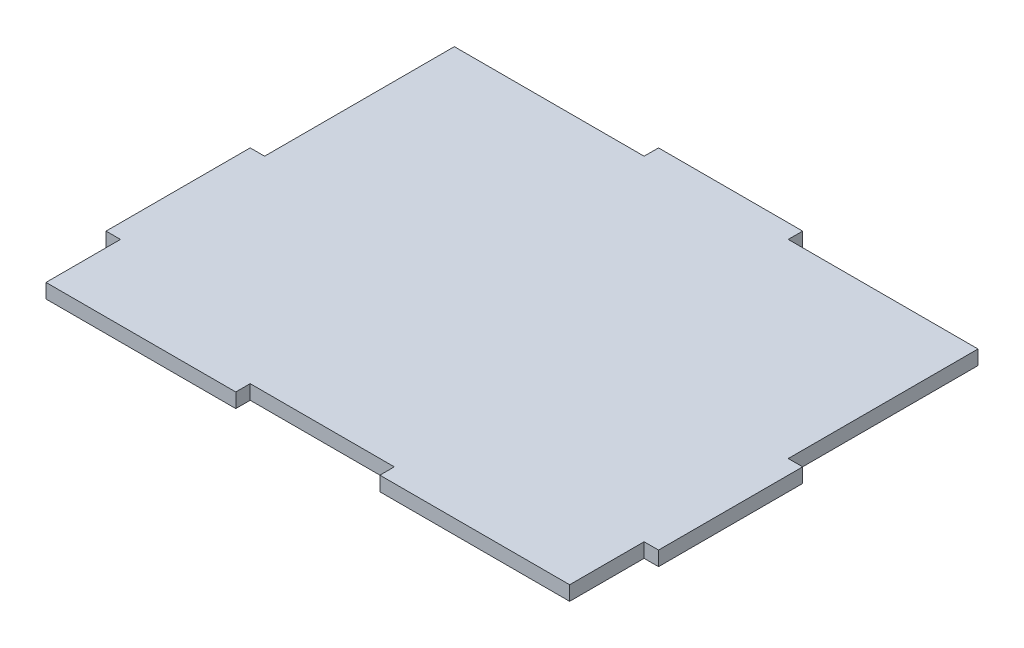
ISO-10303-21;
HEADER;
FILE_DESCRIPTION(('STEP AP214'),'2;1');
FILE_NAME('part.step','',(''),(''),'','','');
FILE_SCHEMA(('AUTOMOTIVE_DESIGN { 1 0 10303 214 1 1 1 1 }'));
ENDSEC;
DATA;
#1=APPLICATION_CONTEXT('core data for automotive mechanical design processes');
#2=APPLICATION_PROTOCOL_DEFINITION('international standard','automotive_design',2000,#1);
#3=PRODUCT_CONTEXT('',#1,'mechanical');
#4=PRODUCT('Part','Part','',(#3));
#5=PRODUCT_RELATED_PRODUCT_CATEGORY('part','',(#4));
#6=PRODUCT_DEFINITION_FORMATION('','',#4);
#7=PRODUCT_DEFINITION_CONTEXT('part definition',#1,'design');
#8=PRODUCT_DEFINITION('design','',#6,#7);
#9=PRODUCT_DEFINITION_SHAPE('','',#8);
#10=(LENGTH_UNIT() NAMED_UNIT(*) SI_UNIT(.MILLI.,.METRE.));
#11=(NAMED_UNIT(*) PLANE_ANGLE_UNIT() SI_UNIT($,.RADIAN.));
#12=(NAMED_UNIT(*) SI_UNIT($,.STERADIAN.) SOLID_ANGLE_UNIT());
#13=UNCERTAINTY_MEASURE_WITH_UNIT(LENGTH_MEASURE(1.E-05),#10,'distance_accuracy_value','');
#14=(GEOMETRIC_REPRESENTATION_CONTEXT(3) GLOBAL_UNCERTAINTY_ASSIGNED_CONTEXT((#13)) GLOBAL_UNIT_ASSIGNED_CONTEXT((#10,
#11,#12)) REPRESENTATION_CONTEXT('',''));
#15=CARTESIAN_POINT('',(0.,0.,0.));
#16=DIRECTION('',(0.,0.,1.));
#17=DIRECTION('',(1.,0.,0.));
#18=AXIS2_PLACEMENT_3D('',#15,#16,#17);
#19=CARTESIAN_POINT('',(54.5,3.,0.));
#20=DIRECTION('',(1.,0.,0.));
#21=DIRECTION('',(0.,0.,-1.));
#22=AXIS2_PLACEMENT_3D('',#19,#20,#21);
#23=PLANE('',#22);
#24=DIRECTION('',(0.,1.,0.));
#25=VECTOR('',#24,1.);
#26=CARTESIAN_POINT('',(54.5,-7.,30.4997169116293));
#27=LINE('',#26,#25);
#28=CARTESIAN_POINT('',(54.5,0.,30.4997169116293));
#29=VERTEX_POINT('',#28);
#30=CARTESIAN_POINT('',(54.5,3.,30.4997169116293));
#31=VERTEX_POINT('',#30);
#32=EDGE_CURVE('E290',#29,#31,#27,.T.);
#33=ORIENTED_EDGE('',*,*,#32,.F.);
#34=DIRECTION('',(0.,0.,1.));
#35=VECTOR('',#34,1.);
#36=CARTESIAN_POINT('',(54.5,0.,0.));
#37=LINE('',#36,#35);
#38=CARTESIAN_POINT('',(54.5,0.,15.));
#39=VERTEX_POINT('',#38);
#40=EDGE_CURVE('E192',#39,#29,#37,.T.);
#41=ORIENTED_EDGE('',*,*,#40,.F.);
#42=DIRECTION('',(0.,-1.,0.));
#43=VECTOR('',#42,1.);
#44=CARTESIAN_POINT('',(54.5,3.,15.));
#45=LINE('',#44,#43);
#46=CARTESIAN_POINT('',(54.5,3.,15.));
#47=VERTEX_POINT('',#46);
#48=EDGE_CURVE('E122',#47,#39,#45,.T.);
#49=ORIENTED_EDGE('',*,*,#48,.F.);
#50=DIRECTION('',(0.,0.,1.));
#51=VECTOR('',#50,1.);
#52=CARTESIAN_POINT('',(54.5,3.,0.));
#53=LINE('',#52,#51);
#54=EDGE_CURVE('E296',#47,#31,#53,.T.);
#55=ORIENTED_EDGE('',*,*,#54,.T.);
#56=EDGE_LOOP('',(#33,#41,#49,#55));
#57=FACE_BOUND('',#56,.T.);
#58=ADVANCED_FACE('F39',(#57),#23,.T.);
#59=CARTESIAN_POINT('',(0.,3.,15.));
#60=DIRECTION('',(0.,0.,-1.));
#61=DIRECTION('',(-1.,0.,0.));
#62=AXIS2_PLACEMENT_3D('',#59,#60,#61);
#63=PLANE('',#62);
#64=DIRECTION('',(1.,0.,0.));
#65=VECTOR('',#64,1.);
#66=CARTESIAN_POINT('',(0.,0.,15.));
#67=LINE('',#66,#65);
#68=CARTESIAN_POINT('',(57.5,0.,15.));
#69=VERTEX_POINT('',#68);
#70=EDGE_CURVE('E195',#39,#69,#67,.T.);
#71=ORIENTED_EDGE('',*,*,#70,.T.);
#72=DIRECTION('',(0.,-1.,0.));
#73=VECTOR('',#72,1.);
#74=CARTESIAN_POINT('',(57.5,3.,15.));
#75=LINE('',#74,#73);
#76=CARTESIAN_POINT('',(57.5,3.,15.));
#77=VERTEX_POINT('',#76);
#78=EDGE_CURVE('E247',#77,#69,#75,.T.);
#79=ORIENTED_EDGE('',*,*,#78,.F.);
#80=DIRECTION('',(1.,0.,0.));
#81=VECTOR('',#80,1.);
#82=CARTESIAN_POINT('',(0.,3.,15.));
#83=LINE('',#82,#81);
#84=EDGE_CURVE('E298',#47,#77,#83,.T.);
#85=ORIENTED_EDGE('',*,*,#84,.F.);
#86=ORIENTED_EDGE('',*,*,#48,.T.);
#87=EDGE_LOOP('',(#71,#79,#85,#86));
#88=FACE_BOUND('',#87,.T.);
#89=ADVANCED_FACE('F41',(#88),#63,.F.);
#90=CARTESIAN_POINT('',(57.5,3.,0.));
#91=DIRECTION('',(1.,0.,0.));
#92=DIRECTION('',(0.,0.,-1.));
#93=AXIS2_PLACEMENT_3D('',#90,#91,#92);
#94=PLANE('',#93);
#95=DIRECTION('',(0.,0.,1.));
#96=VECTOR('',#95,1.);
#97=CARTESIAN_POINT('',(57.5,0.,0.));
#98=LINE('',#97,#96);
#99=CARTESIAN_POINT('',(57.5,0.,-15.));
#100=VERTEX_POINT('',#99);
#101=EDGE_CURVE('E200',#100,#69,#98,.T.);
#102=ORIENTED_EDGE('',*,*,#101,.F.);
#103=DIRECTION('',(0.,-1.,0.));
#104=VECTOR('',#103,1.);
#105=CARTESIAN_POINT('',(57.5,3.,-15.));
#106=LINE('',#105,#104);
#107=CARTESIAN_POINT('',(57.5,3.,-15.));
#108=VERTEX_POINT('',#107);
#109=EDGE_CURVE('E245',#108,#100,#106,.T.);
#110=ORIENTED_EDGE('',*,*,#109,.F.);
#111=DIRECTION('',(0.,0.,1.));
#112=VECTOR('',#111,1.);
#113=CARTESIAN_POINT('',(57.5,3.,0.));
#114=LINE('',#113,#112);
#115=EDGE_CURVE('E301',#108,#77,#114,.T.);
#116=ORIENTED_EDGE('',*,*,#115,.T.);
#117=ORIENTED_EDGE('',*,*,#78,.T.);
#118=EDGE_LOOP('',(#102,#110,#116,#117));
#119=FACE_BOUND('',#118,.T.);
#120=ADVANCED_FACE('F381',(#119),#94,.T.);
#121=CARTESIAN_POINT('',(0.,3.,-15.));
#122=DIRECTION('',(0.,0.,1.));
#123=DIRECTION('',(1.,0.,0.));
#124=AXIS2_PLACEMENT_3D('',#121,#122,#123);
#125=PLANE('',#124);
#126=DIRECTION('',(-1.,0.,0.));
#127=VECTOR('',#126,1.);
#128=CARTESIAN_POINT('',(0.,0.,-15.));
#129=LINE('',#128,#127);
#130=CARTESIAN_POINT('',(54.5,0.,-15.));
#131=VERTEX_POINT('',#130);
#132=EDGE_CURVE('E203',#100,#131,#129,.T.);
#133=ORIENTED_EDGE('',*,*,#132,.T.);
#134=DIRECTION('',(0.,-1.,0.));
#135=VECTOR('',#134,1.);
#136=CARTESIAN_POINT('',(54.5,3.,-15.));
#137=LINE('',#136,#135);
#138=CARTESIAN_POINT('',(54.5,3.,-15.));
#139=VERTEX_POINT('',#138);
#140=EDGE_CURVE('E243',#139,#131,#137,.T.);
#141=ORIENTED_EDGE('',*,*,#140,.F.);
#142=DIRECTION('',(-1.,0.,0.));
#143=VECTOR('',#142,1.);
#144=CARTESIAN_POINT('',(0.,3.,-15.));
#145=LINE('',#144,#143);
#146=EDGE_CURVE('E304',#108,#139,#145,.T.);
#147=ORIENTED_EDGE('',*,*,#146,.F.);
#148=ORIENTED_EDGE('',*,*,#109,.T.);
#149=EDGE_LOOP('',(#133,#141,#147,#148));
#150=FACE_BOUND('',#149,.T.);
#151=ADVANCED_FACE('F386',(#150),#125,.F.);
#152=CARTESIAN_POINT('',(54.5,0.,-54.5));
#153=VERTEX_POINT('',#152);
#154=EDGE_CURVE('E197',#153,#131,#37,.T.);
#155=ORIENTED_EDGE('',*,*,#154,.F.);
#156=DIRECTION('',(0.,-1.,0.));
#157=VECTOR('',#156,1.);
#158=CARTESIAN_POINT('',(54.5,3.,-54.5));
#159=LINE('',#158,#157);
#160=CARTESIAN_POINT('',(54.5,3.,-54.5));
#161=VERTEX_POINT('',#160);
#162=EDGE_CURVE('E241',#161,#153,#159,.T.);
#163=ORIENTED_EDGE('',*,*,#162,.F.);
#164=EDGE_CURVE('E299',#161,#139,#53,.T.);
#165=ORIENTED_EDGE('',*,*,#164,.T.);
#166=ORIENTED_EDGE('',*,*,#140,.T.);
#167=EDGE_LOOP('',(#155,#163,#165,#166));
#168=FACE_BOUND('',#167,.T.);
#169=ADVANCED_FACE('F375',(#168),#23,.T.);
#170=CARTESIAN_POINT('',(0.,3.,-54.5));
#171=DIRECTION('',(0.,0.,-1.));
#172=DIRECTION('',(-1.,0.,0.));
#173=AXIS2_PLACEMENT_3D('',#170,#171,#172);
#174=PLANE('',#173);
#175=DIRECTION('',(1.,0.,0.));
#176=VECTOR('',#175,1.);
#177=CARTESIAN_POINT('',(0.,0.,-54.5));
#178=LINE('',#177,#176);
#179=CARTESIAN_POINT('',(15.,0.,-54.5));
#180=VERTEX_POINT('',#179);
#181=EDGE_CURVE('E206',#180,#153,#178,.T.);
#182=ORIENTED_EDGE('',*,*,#181,.F.);
#183=DIRECTION('',(0.,-1.,0.));
#184=VECTOR('',#183,1.);
#185=CARTESIAN_POINT('',(15.,3.,-54.5));
#186=LINE('',#185,#184);
#187=CARTESIAN_POINT('',(15.,3.,-54.5));
#188=VERTEX_POINT('',#187);
#189=EDGE_CURVE('E239',#188,#180,#186,.T.);
#190=ORIENTED_EDGE('',*,*,#189,.F.);
#191=DIRECTION('',(1.,0.,0.));
#192=VECTOR('',#191,1.);
#193=CARTESIAN_POINT('',(0.,3.,-54.5));
#194=LINE('',#193,#192);
#195=EDGE_CURVE('E306',#188,#161,#194,.T.);
#196=ORIENTED_EDGE('',*,*,#195,.T.);
#197=ORIENTED_EDGE('',*,*,#162,.T.);
#198=EDGE_LOOP('',(#182,#190,#196,#197));
#199=FACE_BOUND('',#198,.T.);
#200=ADVANCED_FACE('F385',(#199),#174,.T.);
#201=CARTESIAN_POINT('',(14.9999999999994,3.,1.73472347597673E-13));
#202=DIRECTION('',(-1.,0.,0.));
#203=DIRECTION('',(0.,0.,1.));
#204=AXIS2_PLACEMENT_3D('',#201,#202,#203);
#205=PLANE('',#204);
#206=DIRECTION('',(0.,0.,-1.));
#207=VECTOR('',#206,1.);
#208=CARTESIAN_POINT('',(14.9999999999994,0.,1.73472347597673E-13));
#209=LINE('',#208,#207);
#210=CARTESIAN_POINT('',(15.,0.,-57.5));
#211=VERTEX_POINT('',#210);
#212=EDGE_CURVE('E209',#180,#211,#209,.T.);
#213=ORIENTED_EDGE('',*,*,#212,.T.);
#214=DIRECTION('',(0.,-1.,0.));
#215=VECTOR('',#214,1.);
#216=CARTESIAN_POINT('',(15.,3.,-57.5));
#217=LINE('',#216,#215);
#218=CARTESIAN_POINT('',(15.,3.,-57.5));
#219=VERTEX_POINT('',#218);
#220=EDGE_CURVE('E236',#219,#211,#217,.T.);
#221=ORIENTED_EDGE('',*,*,#220,.F.);
#222=DIRECTION('',(0.,0.,-1.));
#223=VECTOR('',#222,1.);
#224=CARTESIAN_POINT('',(14.9999999999994,3.,1.73472347597673E-13));
#225=LINE('',#224,#223);
#226=EDGE_CURVE('E309',#188,#219,#225,.T.);
#227=ORIENTED_EDGE('',*,*,#226,.F.);
#228=ORIENTED_EDGE('',*,*,#189,.T.);
#229=EDGE_LOOP('',(#213,#221,#227,#228));
#230=FACE_BOUND('',#229,.T.);
#231=ADVANCED_FACE('F392',(#230),#205,.F.);
#232=CARTESIAN_POINT('',(0.,3.,-57.5));
#233=DIRECTION('',(0.,0.,1.));
#234=DIRECTION('',(1.,0.,0.));
#235=AXIS2_PLACEMENT_3D('',#232,#233,#234);
#236=PLANE('',#235);
#237=DIRECTION('',(-1.,0.,0.));
#238=VECTOR('',#237,1.);
#239=CARTESIAN_POINT('',(0.,0.,-57.5));
#240=LINE('',#239,#238);
#241=CARTESIAN_POINT('',(-15.,0.,-57.5));
#242=VERTEX_POINT('',#241);
#243=EDGE_CURVE('E212',#211,#242,#240,.T.);
#244=ORIENTED_EDGE('',*,*,#243,.T.);
#245=DIRECTION('',(0.,-1.,0.));
#246=VECTOR('',#245,1.);
#247=CARTESIAN_POINT('',(-15.,3.,-57.5));
#248=LINE('',#247,#246);
#249=CARTESIAN_POINT('',(-15.,3.,-57.5));
#250=VERTEX_POINT('',#249);
#251=EDGE_CURVE('E233',#250,#242,#248,.T.);
#252=ORIENTED_EDGE('',*,*,#251,.F.);
#253=DIRECTION('',(-1.,0.,0.));
#254=VECTOR('',#253,1.);
#255=CARTESIAN_POINT('',(0.,3.,-57.5));
#256=LINE('',#255,#254);
#257=EDGE_CURVE('E311',#219,#250,#256,.T.);
#258=ORIENTED_EDGE('',*,*,#257,.F.);
#259=ORIENTED_EDGE('',*,*,#220,.T.);
#260=EDGE_LOOP('',(#244,#252,#258,#259));
#261=FACE_BOUND('',#260,.T.);
#262=ADVANCED_FACE('F442',(#261),#236,.F.);
#263=CARTESIAN_POINT('',(-14.9999999999996,3.,1.04083408558606E-13));
#264=DIRECTION('',(1.,0.,0.));
#265=DIRECTION('',(0.,0.,-1.));
#266=AXIS2_PLACEMENT_3D('',#263,#264,#265);
#267=PLANE('',#266);
#268=DIRECTION('',(0.,0.,1.));
#269=VECTOR('',#268,1.);
#270=CARTESIAN_POINT('',(-14.9999999999996,0.,1.04083408558606E-13));
#271=LINE('',#270,#269);
#272=CARTESIAN_POINT('',(-15.,0.,-54.5));
#273=VERTEX_POINT('',#272);
#274=EDGE_CURVE('E214',#242,#273,#271,.T.);
#275=ORIENTED_EDGE('',*,*,#274,.T.);
#276=DIRECTION('',(0.,-1.,0.));
#277=VECTOR('',#276,1.);
#278=CARTESIAN_POINT('',(-15.,3.,-54.5));
#279=LINE('',#278,#277);
#280=CARTESIAN_POINT('',(-15.,3.,-54.5));
#281=VERTEX_POINT('',#280);
#282=EDGE_CURVE('E231',#281,#273,#279,.T.);
#283=ORIENTED_EDGE('',*,*,#282,.F.);
#284=DIRECTION('',(0.,0.,1.));
#285=VECTOR('',#284,1.);
#286=CARTESIAN_POINT('',(-14.9999999999996,3.,1.04083408558606E-13));
#287=LINE('',#286,#285);
#288=EDGE_CURVE('E312',#250,#281,#287,.T.);
#289=ORIENTED_EDGE('',*,*,#288,.F.);
#290=ORIENTED_EDGE('',*,*,#251,.T.);
#291=EDGE_LOOP('',(#275,#283,#289,#290));
#292=FACE_BOUND('',#291,.T.);
#293=ADVANCED_FACE('F452',(#292),#267,.F.);
#294=CARTESIAN_POINT('',(-54.5,0.,-54.5));
#295=VERTEX_POINT('',#294);
#296=EDGE_CURVE('E210',#295,#273,#178,.T.);
#297=ORIENTED_EDGE('',*,*,#296,.F.);
#298=DIRECTION('',(0.,-1.,0.));
#299=VECTOR('',#298,1.);
#300=CARTESIAN_POINT('',(-54.5,3.,-54.5));
#301=LINE('',#300,#299);
#302=CARTESIAN_POINT('',(-54.5,3.,-54.5));
#303=VERTEX_POINT('',#302);
#304=EDGE_CURVE('E229',#303,#295,#301,.T.);
#305=ORIENTED_EDGE('',*,*,#304,.F.);
#306=EDGE_CURVE('E187',#303,#281,#194,.T.);
#307=ORIENTED_EDGE('',*,*,#306,.T.);
#308=ORIENTED_EDGE('',*,*,#282,.T.);
#309=EDGE_LOOP('',(#297,#305,#307,#308));
#310=FACE_BOUND('',#309,.T.);
#311=ADVANCED_FACE('F318',(#310),#174,.T.);
#312=CARTESIAN_POINT('',(-54.5,3.,0.));
#313=DIRECTION('',(-1.,0.,0.));
#314=DIRECTION('',(0.,0.,1.));
#315=AXIS2_PLACEMENT_3D('',#312,#313,#314);
#316=PLANE('',#315);
#317=DIRECTION('',(0.,0.,-1.));
#318=VECTOR('',#317,1.);
#319=CARTESIAN_POINT('',(-54.5,0.,0.));
#320=LINE('',#319,#318);
#321=CARTESIAN_POINT('',(-54.5,0.,-15.));
#322=VERTEX_POINT('',#321);
#323=EDGE_CURVE('E217',#322,#295,#320,.T.);
#324=ORIENTED_EDGE('',*,*,#323,.F.);
#325=DIRECTION('',(0.,-1.,0.));
#326=VECTOR('',#325,1.);
#327=CARTESIAN_POINT('',(-54.5,3.,-15.));
#328=LINE('',#327,#326);
#329=CARTESIAN_POINT('',(-54.5,3.,-15.));
#330=VERTEX_POINT('',#329);
#331=EDGE_CURVE('E169',#330,#322,#328,.T.);
#332=ORIENTED_EDGE('',*,*,#331,.F.);
#333=DIRECTION('',(0.,0.,-1.));
#334=VECTOR('',#333,1.);
#335=CARTESIAN_POINT('',(-54.5,3.,0.));
#336=LINE('',#335,#334);
#337=EDGE_CURVE('E185',#330,#303,#336,.T.);
#338=ORIENTED_EDGE('',*,*,#337,.T.);
#339=ORIENTED_EDGE('',*,*,#304,.T.);
#340=EDGE_LOOP('',(#324,#332,#338,#339));
#341=FACE_BOUND('',#340,.T.);
#342=ADVANCED_FACE('F321',(#341),#316,.T.);
#343=CARTESIAN_POINT('',(0.,3.,-15.));
#344=DIRECTION('',(0.,0.,-1.));
#345=DIRECTION('',(-1.,0.,0.));
#346=AXIS2_PLACEMENT_3D('',#343,#344,#345);
#347=PLANE('',#346);
#348=DIRECTION('',(1.,0.,0.));
#349=VECTOR('',#348,1.);
#350=CARTESIAN_POINT('',(0.,0.,-15.));
#351=LINE('',#350,#349);
#352=CARTESIAN_POINT('',(-57.5,0.,-15.));
#353=VERTEX_POINT('',#352);
#354=EDGE_CURVE('E165',#353,#322,#351,.T.);
#355=ORIENTED_EDGE('',*,*,#354,.F.);
#356=DIRECTION('',(0.,-1.,0.));
#357=VECTOR('',#356,1.);
#358=CARTESIAN_POINT('',(-57.5,3.,-15.));
#359=LINE('',#358,#357);
#360=CARTESIAN_POINT('',(-57.5,3.,-15.));
#361=VERTEX_POINT('',#360);
#362=EDGE_CURVE('E159',#361,#353,#359,.T.);
#363=ORIENTED_EDGE('',*,*,#362,.F.);
#364=DIRECTION('',(1.,0.,0.));
#365=VECTOR('',#364,1.);
#366=CARTESIAN_POINT('',(0.,3.,-15.));
#367=LINE('',#366,#365);
#368=EDGE_CURVE('E163',#361,#330,#367,.T.);
#369=ORIENTED_EDGE('',*,*,#368,.T.);
#370=ORIENTED_EDGE('',*,*,#331,.T.);
#371=EDGE_LOOP('',(#355,#363,#369,#370));
#372=FACE_BOUND('',#371,.T.);
#373=ADVANCED_FACE('F161',(#372),#347,.T.);
#374=CARTESIAN_POINT('',(-57.5,3.,0.));
#375=DIRECTION('',(1.,0.,0.));
#376=DIRECTION('',(0.,0.,-1.));
#377=AXIS2_PLACEMENT_3D('',#374,#375,#376);
#378=PLANE('',#377);
#379=DIRECTION('',(0.,0.,1.));
#380=VECTOR('',#379,1.);
#381=CARTESIAN_POINT('',(-57.5,0.,0.));
#382=LINE('',#381,#380);
#383=CARTESIAN_POINT('',(-57.5,0.,15.));
#384=VERTEX_POINT('',#383);
#385=EDGE_CURVE('E221',#353,#384,#382,.T.);
#386=ORIENTED_EDGE('',*,*,#385,.T.);
#387=DIRECTION('',(0.,-1.,0.));
#388=VECTOR('',#387,1.);
#389=CARTESIAN_POINT('',(-57.5,3.,15.));
#390=LINE('',#389,#388);
#391=CARTESIAN_POINT('',(-57.5,3.,15.));
#392=VERTEX_POINT('',#391);
#393=EDGE_CURVE('E170',#392,#384,#390,.T.);
#394=ORIENTED_EDGE('',*,*,#393,.F.);
#395=DIRECTION('',(0.,0.,1.));
#396=VECTOR('',#395,1.);
#397=CARTESIAN_POINT('',(-57.5,3.,0.));
#398=LINE('',#397,#396);
#399=EDGE_CURVE('E173',#361,#392,#398,.T.);
#400=ORIENTED_EDGE('',*,*,#399,.F.);
#401=ORIENTED_EDGE('',*,*,#362,.T.);
#402=EDGE_LOOP('',(#386,#394,#400,#401));
#403=FACE_BOUND('',#402,.T.);
#404=ADVANCED_FACE('F174',(#403),#378,.F.);
#405=CARTESIAN_POINT('',(1.38777878078138E-13,3.,14.9999999999995));
#406=DIRECTION('',(0.,0.,1.));
#407=DIRECTION('',(1.,0.,0.));
#408=AXIS2_PLACEMENT_3D('',#405,#406,#407);
#409=PLANE('',#408);
#410=DIRECTION('',(-1.,0.,0.));
#411=VECTOR('',#410,1.);
#412=CARTESIAN_POINT('',(1.38777878078138E-13,0.,14.9999999999995));
#413=LINE('',#412,#411);
#414=CARTESIAN_POINT('',(-54.5,0.,15.));
#415=VERTEX_POINT('',#414);
#416=EDGE_CURVE('E223',#415,#384,#413,.T.);
#417=ORIENTED_EDGE('',*,*,#416,.F.);
#418=DIRECTION('',(0.,-1.,0.));
#419=VECTOR('',#418,1.);
#420=CARTESIAN_POINT('',(-54.5,3.,15.));
#421=LINE('',#420,#419);
#422=CARTESIAN_POINT('',(-54.5,3.,15.));
#423=VERTEX_POINT('',#422);
#424=EDGE_CURVE('E225',#423,#415,#421,.T.);
#425=ORIENTED_EDGE('',*,*,#424,.F.);
#426=DIRECTION('',(-1.,0.,0.));
#427=VECTOR('',#426,1.);
#428=CARTESIAN_POINT('',(1.38777878078138E-13,3.,14.9999999999995));
#429=LINE('',#428,#427);
#430=EDGE_CURVE('E178',#423,#392,#429,.T.);
#431=ORIENTED_EDGE('',*,*,#430,.T.);
#432=ORIENTED_EDGE('',*,*,#393,.T.);
#433=EDGE_LOOP('',(#417,#425,#431,#432));
#434=FACE_BOUND('',#433,.T.);
#435=ADVANCED_FACE('F325',(#434),#409,.T.);
#436=DIRECTION('',(0.,1.,0.));
#437=VECTOR('',#436,1.);
#438=CARTESIAN_POINT('',(-54.5,-7.,30.5));
#439=LINE('',#438,#437);
#440=CARTESIAN_POINT('',(-54.5,0.,30.5));
#441=VERTEX_POINT('',#440);
#442=CARTESIAN_POINT('',(-54.5,3.,30.5));
#443=VERTEX_POINT('',#442);
#444=EDGE_CURVE('E293',#441,#443,#439,.T.);
#445=ORIENTED_EDGE('',*,*,#444,.T.);
#446=EDGE_CURVE('E63',#443,#423,#336,.T.);
#447=ORIENTED_EDGE('',*,*,#446,.T.);
#448=ORIENTED_EDGE('',*,*,#424,.T.);
#449=EDGE_CURVE('E115',#441,#415,#320,.T.);
#450=ORIENTED_EDGE('',*,*,#449,.F.);
#451=EDGE_LOOP('',(#445,#447,#448,#450));
#452=FACE_BOUND('',#451,.T.);
#453=ADVANCED_FACE('F484',(#452),#316,.T.);
#454=CARTESIAN_POINT('',(0.,3.,0.));
#455=DIRECTION('',(0.,1.,0.));
#456=DIRECTION('',(0.,0.,1.));
#457=AXIS2_PLACEMENT_3D('',#454,#455,#456);
#458=PLANE('',#457);
#459=DIRECTION('',(-1.,0.,0.));
#460=VECTOR('',#459,1.);
#461=CARTESIAN_POINT('',(-15.,3.,30.5));
#462=LINE('',#461,#460);
#463=CARTESIAN_POINT('',(-15.,3.,30.5));
#464=VERTEX_POINT('',#463);
#465=EDGE_CURVE('E329',#464,#443,#462,.T.);
#466=ORIENTED_EDGE('',*,*,#465,.F.);
#467=DIRECTION('',(0.,0.,1.));
#468=VECTOR('',#467,1.);
#469=CARTESIAN_POINT('',(-15.,3.,30.5));
#470=LINE('',#469,#468);
#471=CARTESIAN_POINT('',(-15.,3.,27.5));
#472=VERTEX_POINT('',#471);
#473=EDGE_CURVE('E295',#472,#464,#470,.T.);
#474=ORIENTED_EDGE('',*,*,#473,.F.);
#475=DIRECTION('',(-1.,0.,0.));
#476=VECTOR('',#475,1.);
#477=CARTESIAN_POINT('',(-15.,3.,27.5));
#478=LINE('',#477,#476);
#479=CARTESIAN_POINT('',(15.,3.,27.5));
#480=VERTEX_POINT('',#479);
#481=EDGE_CURVE('E281',#480,#472,#478,.T.);
#482=ORIENTED_EDGE('',*,*,#481,.F.);
#483=DIRECTION('',(0.,0.,-1.));
#484=VECTOR('',#483,1.);
#485=CARTESIAN_POINT('',(15.,3.,30.4997169116293));
#486=LINE('',#485,#484);
#487=CARTESIAN_POINT('',(15.,3.,30.4997169116293));
#488=VERTEX_POINT('',#487);
#489=EDGE_CURVE('E358',#488,#480,#486,.T.);
#490=ORIENTED_EDGE('',*,*,#489,.F.);
#491=DIRECTION('',(-1.,0.,0.));
#492=VECTOR('',#491,1.);
#493=CARTESIAN_POINT('',(54.5,3.,30.4997169116293));
#494=LINE('',#493,#492);
#495=EDGE_CURVE('E356',#31,#488,#494,.T.);
#496=ORIENTED_EDGE('',*,*,#495,.F.);
#497=ORIENTED_EDGE('',*,*,#54,.F.);
#498=ORIENTED_EDGE('',*,*,#84,.T.);
#499=ORIENTED_EDGE('',*,*,#115,.F.);
#500=ORIENTED_EDGE('',*,*,#146,.T.);
#501=ORIENTED_EDGE('',*,*,#164,.F.);
#502=ORIENTED_EDGE('',*,*,#195,.F.);
#503=ORIENTED_EDGE('',*,*,#226,.T.);
#504=ORIENTED_EDGE('',*,*,#257,.T.);
#505=ORIENTED_EDGE('',*,*,#288,.T.);
#506=ORIENTED_EDGE('',*,*,#306,.F.);
#507=ORIENTED_EDGE('',*,*,#337,.F.);
#508=ORIENTED_EDGE('',*,*,#368,.F.);
#509=ORIENTED_EDGE('',*,*,#399,.T.);
#510=ORIENTED_EDGE('',*,*,#430,.F.);
#511=ORIENTED_EDGE('',*,*,#446,.F.);
#512=EDGE_LOOP('',(#466,#474,#482,#490,#496,#497,#498,#499,#500,#501,#502,#503,#504,#505,#506,
#507,#508,#509,#510,#511));
#513=FACE_BOUND('',#512,.T.);
#514=ADVANCED_FACE('F182',(#513),#458,.T.);
#515=CARTESIAN_POINT('',(0.,0.,0.));
#516=DIRECTION('',(0.,1.,0.));
#517=DIRECTION('',(0.,0.,1.));
#518=AXIS2_PLACEMENT_3D('',#515,#516,#517);
#519=PLANE('',#518);
#520=DIRECTION('',(0.,0.,1.));
#521=VECTOR('',#520,1.);
#522=CARTESIAN_POINT('',(-15.,0.,0.));
#523=LINE('',#522,#521);
#524=CARTESIAN_POINT('',(-15.,0.,27.5));
#525=VERTEX_POINT('',#524);
#526=CARTESIAN_POINT('',(-15.,0.,30.5));
#527=VERTEX_POINT('',#526);
#528=EDGE_CURVE('E47',#525,#527,#523,.T.);
#529=ORIENTED_EDGE('',*,*,#528,.T.);
#530=DIRECTION('',(-1.,0.,0.));
#531=VECTOR('',#530,1.);
#532=CARTESIAN_POINT('',(0.,0.,30.5));
#533=LINE('',#532,#531);
#534=EDGE_CURVE('E11',#527,#441,#533,.T.);
#535=ORIENTED_EDGE('',*,*,#534,.T.);
#536=ORIENTED_EDGE('',*,*,#449,.T.);
#537=ORIENTED_EDGE('',*,*,#416,.T.);
#538=ORIENTED_EDGE('',*,*,#385,.F.);
#539=ORIENTED_EDGE('',*,*,#354,.T.);
#540=ORIENTED_EDGE('',*,*,#323,.T.);
#541=ORIENTED_EDGE('',*,*,#296,.T.);
#542=ORIENTED_EDGE('',*,*,#274,.F.);
#543=ORIENTED_EDGE('',*,*,#243,.F.);
#544=ORIENTED_EDGE('',*,*,#212,.F.);
#545=ORIENTED_EDGE('',*,*,#181,.T.);
#546=ORIENTED_EDGE('',*,*,#154,.T.);
#547=ORIENTED_EDGE('',*,*,#132,.F.);
#548=ORIENTED_EDGE('',*,*,#101,.T.);
#549=ORIENTED_EDGE('',*,*,#70,.F.);
#550=ORIENTED_EDGE('',*,*,#40,.T.);
#551=DIRECTION('',(-1.,0.,0.));
#552=VECTOR('',#551,1.);
#553=CARTESIAN_POINT('',(0.,0.,30.4997169116293));
#554=LINE('',#553,#552);
#555=CARTESIAN_POINT('',(15.,0.,30.4997169116293));
#556=VERTEX_POINT('',#555);
#557=EDGE_CURVE('E250',#29,#556,#554,.T.);
#558=ORIENTED_EDGE('',*,*,#557,.T.);
#559=DIRECTION('',(0.,0.,-1.));
#560=VECTOR('',#559,1.);
#561=CARTESIAN_POINT('',(15.,0.,0.));
#562=LINE('',#561,#560);
#563=CARTESIAN_POINT('',(15.,0.,27.5));
#564=VERTEX_POINT('',#563);
#565=EDGE_CURVE('E253',#556,#564,#562,.T.);
#566=ORIENTED_EDGE('',*,*,#565,.T.);
#567=DIRECTION('',(-1.,0.,0.));
#568=VECTOR('',#567,1.);
#569=CARTESIAN_POINT('',(0.,0.,27.5));
#570=LINE('',#569,#568);
#571=EDGE_CURVE('E256',#564,#525,#570,.T.);
#572=ORIENTED_EDGE('',*,*,#571,.T.);
#573=EDGE_LOOP('',(#529,#535,#536,#537,#538,#539,#540,#541,#542,#543,#544,#545,#546,#547,#548,
#549,#550,#558,#566,#572));
#574=FACE_BOUND('',#573,.T.);
#575=ADVANCED_FACE('F260',(#574),#519,.F.);
#576=CARTESIAN_POINT('',(-15.,-7.,30.5));
#577=DIRECTION('',(0.,0.,-1.));
#578=DIRECTION('',(-1.,0.,0.));
#579=AXIS2_PLACEMENT_3D('',#576,#577,#578);
#580=PLANE('',#579);
#581=DIRECTION('',(0.,1.,0.));
#582=VECTOR('',#581,1.);
#583=CARTESIAN_POINT('',(-15.,-7.,30.5));
#584=LINE('',#583,#582);
#585=EDGE_CURVE('E196',#527,#464,#584,.T.);
#586=ORIENTED_EDGE('',*,*,#585,.T.);
#587=ORIENTED_EDGE('',*,*,#465,.T.);
#588=ORIENTED_EDGE('',*,*,#444,.F.);
#589=ORIENTED_EDGE('',*,*,#534,.F.);
#590=EDGE_LOOP('',(#586,#587,#588,#589));
#591=FACE_BOUND('',#590,.T.);
#592=ADVANCED_FACE('F538',(#591),#580,.F.);
#593=CARTESIAN_POINT('',(-15.,-7.,30.5));
#594=DIRECTION('',(-1.,0.,0.));
#595=DIRECTION('',(0.,0.,1.));
#596=AXIS2_PLACEMENT_3D('',#593,#594,#595);
#597=PLANE('',#596);
#598=DIRECTION('',(0.,1.,0.));
#599=VECTOR('',#598,1.);
#600=CARTESIAN_POINT('',(-15.,-7.,27.5));
#601=LINE('',#600,#599);
#602=EDGE_CURVE('E272',#525,#472,#601,.T.);
#603=ORIENTED_EDGE('',*,*,#602,.T.);
#604=ORIENTED_EDGE('',*,*,#473,.T.);
#605=ORIENTED_EDGE('',*,*,#585,.F.);
#606=ORIENTED_EDGE('',*,*,#528,.F.);
#607=EDGE_LOOP('',(#603,#604,#605,#606));
#608=FACE_BOUND('',#607,.T.);
#609=ADVANCED_FACE('F269',(#608),#597,.F.);
#610=CARTESIAN_POINT('',(-15.,-7.,27.5));
#611=DIRECTION('',(0.,0.,-1.));
#612=DIRECTION('',(-1.,0.,0.));
#613=AXIS2_PLACEMENT_3D('',#610,#611,#612);
#614=PLANE('',#613);
#615=DIRECTION('',(0.,1.,0.));
#616=VECTOR('',#615,1.);
#617=CARTESIAN_POINT('',(15.,-7.,27.5));
#618=LINE('',#617,#616);
#619=EDGE_CURVE('E283',#564,#480,#618,.T.);
#620=ORIENTED_EDGE('',*,*,#619,.T.);
#621=ORIENTED_EDGE('',*,*,#481,.T.);
#622=ORIENTED_EDGE('',*,*,#602,.F.);
#623=ORIENTED_EDGE('',*,*,#571,.F.);
#624=EDGE_LOOP('',(#620,#621,#622,#623));
#625=FACE_BOUND('',#624,.T.);
#626=ADVANCED_FACE('F278',(#625),#614,.F.);
#627=CARTESIAN_POINT('',(15.,-7.,30.4997169116293));
#628=DIRECTION('',(1.,0.,0.));
#629=DIRECTION('',(0.,0.,-1.));
#630=AXIS2_PLACEMENT_3D('',#627,#628,#629);
#631=PLANE('',#630);
#632=DIRECTION('',(0.,1.,0.));
#633=VECTOR('',#632,1.);
#634=CARTESIAN_POINT('',(15.,-7.,30.4997169116293));
#635=LINE('',#634,#633);
#636=EDGE_CURVE('E54',#556,#488,#635,.T.);
#637=ORIENTED_EDGE('',*,*,#636,.T.);
#638=ORIENTED_EDGE('',*,*,#489,.T.);
#639=ORIENTED_EDGE('',*,*,#619,.F.);
#640=ORIENTED_EDGE('',*,*,#565,.F.);
#641=EDGE_LOOP('',(#637,#638,#639,#640));
#642=FACE_BOUND('',#641,.T.);
#643=ADVANCED_FACE('F364',(#642),#631,.F.);
#644=CARTESIAN_POINT('',(54.5,-7.,30.4997169116293));
#645=DIRECTION('',(0.,0.,-1.));
#646=DIRECTION('',(-1.,0.,0.));
#647=AXIS2_PLACEMENT_3D('',#644,#645,#646);
#648=PLANE('',#647);
#649=ORIENTED_EDGE('',*,*,#32,.T.);
#650=ORIENTED_EDGE('',*,*,#495,.T.);
#651=ORIENTED_EDGE('',*,*,#636,.F.);
#652=ORIENTED_EDGE('',*,*,#557,.F.);
#653=EDGE_LOOP('',(#649,#650,#651,#652));
#654=FACE_BOUND('',#653,.T.);
#655=ADVANCED_FACE('F346',(#654),#648,.F.);
#656=CLOSED_SHELL('',(#58,#89,#120,#151,#169,#200,#231,#262,#293,#311,#342,#373,#404,#435,#453,
#514,#575,#592,#609,#626,#643,#655));
#657=MANIFOLD_SOLID_BREP('B2',#656);
#658=ADVANCED_BREP_SHAPE_REPRESENTATION('',(#18,#657),#14);
#659=SHAPE_DEFINITION_REPRESENTATION(#9,#658);
ENDSEC;
END-ISO-10303-21;
